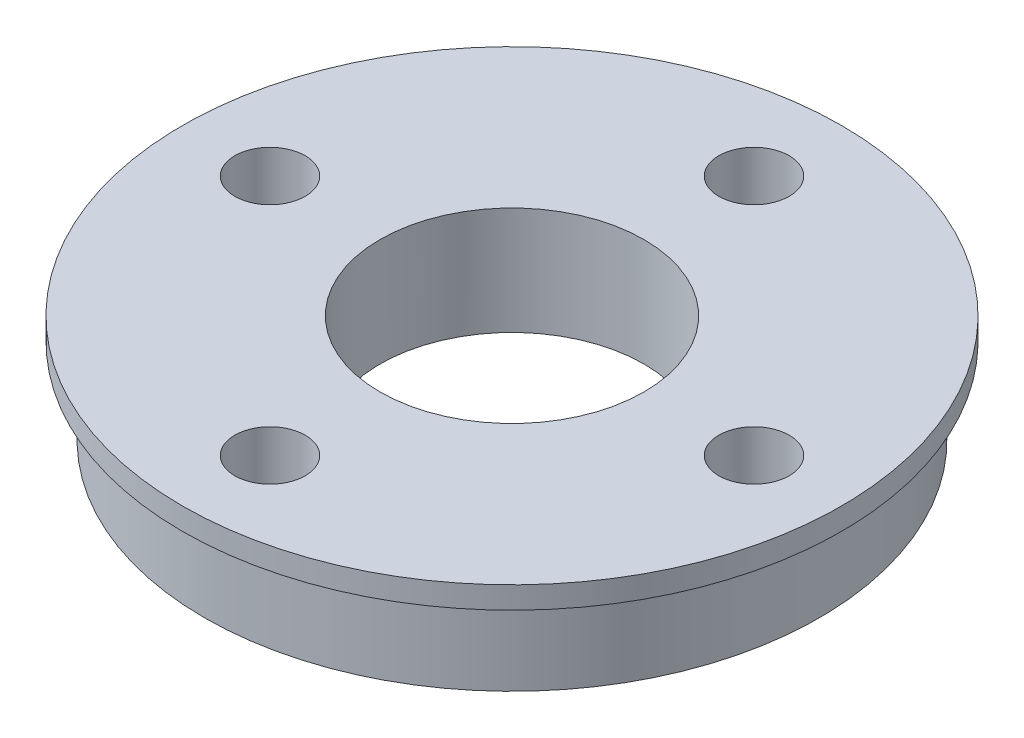
ISO-10303-21;
HEADER;
FILE_DESCRIPTION(('STEP AP214'),'2;1');
FILE_NAME('part.step','',(''),(''),'','','');
FILE_SCHEMA(('AUTOMOTIVE_DESIGN { 1 0 10303 214 1 1 1 1 }'));
ENDSEC;
DATA;
#1=APPLICATION_CONTEXT('core data for automotive mechanical design processes');
#2=APPLICATION_PROTOCOL_DEFINITION('international standard','automotive_design',2000,#1);
#3=PRODUCT_CONTEXT('',#1,'mechanical');
#4=PRODUCT('Part','Part','',(#3));
#5=PRODUCT_RELATED_PRODUCT_CATEGORY('part','',(#4));
#6=PRODUCT_DEFINITION_FORMATION('','',#4);
#7=PRODUCT_DEFINITION_CONTEXT('part definition',#1,'design');
#8=PRODUCT_DEFINITION('design','',#6,#7);
#9=PRODUCT_DEFINITION_SHAPE('','',#8);
#10=(LENGTH_UNIT() NAMED_UNIT(*) SI_UNIT(.MILLI.,.METRE.));
#11=(NAMED_UNIT(*) PLANE_ANGLE_UNIT() SI_UNIT($,.RADIAN.));
#12=(NAMED_UNIT(*) SI_UNIT($,.STERADIAN.) SOLID_ANGLE_UNIT());
#13=UNCERTAINTY_MEASURE_WITH_UNIT(LENGTH_MEASURE(1.E-05),#10,'distance_accuracy_value','');
#14=(GEOMETRIC_REPRESENTATION_CONTEXT(3) GLOBAL_UNCERTAINTY_ASSIGNED_CONTEXT((#13)) GLOBAL_UNIT_ASSIGNED_CONTEXT((#10,
#11,#12)) REPRESENTATION_CONTEXT('',''));
#15=CARTESIAN_POINT('',(0.,0.,0.));
#16=DIRECTION('',(0.,0.,1.));
#17=DIRECTION('',(1.,0.,0.));
#18=AXIS2_PLACEMENT_3D('',#15,#16,#17);
#19=CARTESIAN_POINT('',(0.,19.,0.));
#20=DIRECTION('',(0.,-1.,0.));
#21=DIRECTION('',(0.,0.,-1.));
#22=AXIS2_PLACEMENT_3D('',#19,#20,#21);
#23=CYLINDRICAL_SURFACE('',#22,6.);
#24=CARTESIAN_POINT('',(0.,5.,0.));
#25=DIRECTION('',(0.,1.,0.));
#26=DIRECTION('',(0.,0.,1.));
#27=AXIS2_PLACEMENT_3D('',#24,#25,#26);
#28=CIRCLE('',#27,6.);
#29=CARTESIAN_POINT('',(0.,5.,6.));
#30=VERTEX_POINT('',#29);
#31=EDGE_CURVE('E66',#30,#30,#28,.T.);
#32=ORIENTED_EDGE('',*,*,#31,.T.);
#33=EDGE_LOOP('',(#32));
#34=FACE_BOUND('',#33,.T.);
#35=CARTESIAN_POINT('',(0.,0.0999999999999994,0.));
#36=DIRECTION('',(0.,-1.,0.));
#37=DIRECTION('',(0.,0.,-1.));
#38=AXIS2_PLACEMENT_3D('',#35,#36,#37);
#39=CIRCLE('',#38,6.);
#40=CARTESIAN_POINT('',(0.,0.0999999999999994,-6.));
#41=VERTEX_POINT('',#40);
#42=EDGE_CURVE('E47',#41,#41,#39,.F.);
#43=ORIENTED_EDGE('',*,*,#42,.F.);
#44=EDGE_LOOP('',(#43));
#45=FACE_BOUND('',#44,.T.);
#46=ADVANCED_FACE('F44',(#34,#45),#23,.F.);
#47=CARTESIAN_POINT('',(0.,4.,0.));
#48=DIRECTION('',(0.,-1.,0.));
#49=DIRECTION('',(0.,0.,-1.));
#50=AXIS2_PLACEMENT_3D('',#47,#48,#49);
#51=CYLINDRICAL_SURFACE('',#50,13.98);
#52=CARTESIAN_POINT('',(0.,4.,0.));
#53=DIRECTION('',(0.,1.,0.));
#54=DIRECTION('',(0.,0.,1.));
#55=AXIS2_PLACEMENT_3D('',#52,#53,#54);
#56=CIRCLE('',#55,13.98);
#57=CARTESIAN_POINT('',(0.,4.,13.98));
#58=VERTEX_POINT('',#57);
#59=EDGE_CURVE('E10',#58,#58,#56,.T.);
#60=ORIENTED_EDGE('',*,*,#59,.F.);
#61=EDGE_LOOP('',(#60));
#62=FACE_BOUND('',#61,.T.);
#63=CARTESIAN_POINT('',(0.,0.1,0.));
#64=DIRECTION('',(0.,-1.,0.));
#65=DIRECTION('',(0.,0.,-1.));
#66=AXIS2_PLACEMENT_3D('',#63,#64,#65);
#67=CIRCLE('',#66,13.98);
#68=CARTESIAN_POINT('',(0.,0.1,-13.98));
#69=VERTEX_POINT('',#68);
#70=EDGE_CURVE('E80',#69,#69,#67,.T.);
#71=ORIENTED_EDGE('',*,*,#70,.F.);
#72=EDGE_LOOP('',(#71));
#73=FACE_BOUND('',#72,.T.);
#74=ADVANCED_FACE('F50',(#62,#73),#51,.T.);
#75=CARTESIAN_POINT('',(-11.,19.,0.));
#76=DIRECTION('',(0.,-1.,0.));
#77=DIRECTION('',(0.,0.,-1.));
#78=AXIS2_PLACEMENT_3D('',#75,#76,#77);
#79=CYLINDRICAL_SURFACE('',#78,1.6);
#80=CARTESIAN_POINT('',(-11.,5.,0.));
#81=DIRECTION('',(0.,1.,0.));
#82=DIRECTION('',(0.,0.,1.));
#83=AXIS2_PLACEMENT_3D('',#80,#81,#82);
#84=CIRCLE('',#83,1.6);
#85=CARTESIAN_POINT('',(-11.,5.,1.6));
#86=VERTEX_POINT('',#85);
#87=EDGE_CURVE('E65',#86,#86,#84,.T.);
#88=ORIENTED_EDGE('',*,*,#87,.T.);
#89=EDGE_LOOP('',(#88));
#90=FACE_BOUND('',#89,.T.);
#91=CARTESIAN_POINT('',(-11.,0.0999999999999994,0.));
#92=DIRECTION('',(0.,-1.,0.));
#93=DIRECTION('',(0.,0.,-1.));
#94=AXIS2_PLACEMENT_3D('',#91,#92,#93);
#95=CIRCLE('',#94,1.6);
#96=CARTESIAN_POINT('',(-11.,0.0999999999999994,-1.6));
#97=VERTEX_POINT('',#96);
#98=EDGE_CURVE('E92',#97,#97,#95,.F.);
#99=ORIENTED_EDGE('',*,*,#98,.F.);
#100=EDGE_LOOP('',(#99));
#101=FACE_BOUND('',#100,.T.);
#102=ADVANCED_FACE('F128',(#90,#101),#79,.F.);
#103=CARTESIAN_POINT('',(0.,19.,-11.));
#104=DIRECTION('',(0.,-1.,0.));
#105=DIRECTION('',(0.,0.,-1.));
#106=AXIS2_PLACEMENT_3D('',#103,#104,#105);
#107=CYLINDRICAL_SURFACE('',#106,1.6);
#108=CARTESIAN_POINT('',(0.,5.,-11.));
#109=DIRECTION('',(0.,1.,0.));
#110=DIRECTION('',(0.,0.,1.));
#111=AXIS2_PLACEMENT_3D('',#108,#109,#110);
#112=CIRCLE('',#111,1.6);
#113=CARTESIAN_POINT('',(0.,5.,-9.4));
#114=VERTEX_POINT('',#113);
#115=EDGE_CURVE('E63',#114,#114,#112,.T.);
#116=ORIENTED_EDGE('',*,*,#115,.T.);
#117=EDGE_LOOP('',(#116));
#118=FACE_BOUND('',#117,.T.);
#119=CARTESIAN_POINT('',(0.,0.0999999999999994,-11.));
#120=DIRECTION('',(0.,-1.,0.));
#121=DIRECTION('',(0.,0.,-1.));
#122=AXIS2_PLACEMENT_3D('',#119,#120,#121);
#123=CIRCLE('',#122,1.6);
#124=CARTESIAN_POINT('',(0.,0.0999999999999994,-12.6));
#125=VERTEX_POINT('',#124);
#126=EDGE_CURVE('E82',#125,#125,#123,.F.);
#127=ORIENTED_EDGE('',*,*,#126,.F.);
#128=EDGE_LOOP('',(#127));
#129=FACE_BOUND('',#128,.T.);
#130=ADVANCED_FACE('F137',(#118,#129),#107,.F.);
#131=CARTESIAN_POINT('',(11.,19.,0.));
#132=DIRECTION('',(0.,-1.,0.));
#133=DIRECTION('',(0.,0.,-1.));
#134=AXIS2_PLACEMENT_3D('',#131,#132,#133);
#135=CYLINDRICAL_SURFACE('',#134,1.6);
#136=CARTESIAN_POINT('',(11.,5.,0.));
#137=DIRECTION('',(0.,1.,0.));
#138=DIRECTION('',(0.,0.,1.));
#139=AXIS2_PLACEMENT_3D('',#136,#137,#138);
#140=CIRCLE('',#139,1.6);
#141=CARTESIAN_POINT('',(11.,5.,1.6));
#142=VERTEX_POINT('',#141);
#143=EDGE_CURVE('E68',#142,#142,#140,.T.);
#144=ORIENTED_EDGE('',*,*,#143,.T.);
#145=EDGE_LOOP('',(#144));
#146=FACE_BOUND('',#145,.T.);
#147=CARTESIAN_POINT('',(11.,0.0999999999999994,0.));
#148=DIRECTION('',(0.,-1.,0.));
#149=DIRECTION('',(0.,0.,-1.));
#150=AXIS2_PLACEMENT_3D('',#147,#148,#149);
#151=CIRCLE('',#150,1.6);
#152=CARTESIAN_POINT('',(11.,0.0999999999999994,-1.6));
#153=VERTEX_POINT('',#152);
#154=EDGE_CURVE('E77',#153,#153,#151,.F.);
#155=ORIENTED_EDGE('',*,*,#154,.F.);
#156=EDGE_LOOP('',(#155));
#157=FACE_BOUND('',#156,.T.);
#158=ADVANCED_FACE('F134',(#146,#157),#135,.F.);
#159=CARTESIAN_POINT('',(0.,19.,11.));
#160=DIRECTION('',(0.,-1.,0.));
#161=DIRECTION('',(0.,0.,-1.));
#162=AXIS2_PLACEMENT_3D('',#159,#160,#161);
#163=CYLINDRICAL_SURFACE('',#162,1.6);
#164=CARTESIAN_POINT('',(0.,5.,11.));
#165=DIRECTION('',(0.,1.,0.));
#166=DIRECTION('',(0.,0.,1.));
#167=AXIS2_PLACEMENT_3D('',#164,#165,#166);
#168=CIRCLE('',#167,1.6);
#169=CARTESIAN_POINT('',(0.,5.,12.6));
#170=VERTEX_POINT('',#169);
#171=EDGE_CURVE('E75',#170,#170,#168,.T.);
#172=ORIENTED_EDGE('',*,*,#171,.T.);
#173=EDGE_LOOP('',(#172));
#174=FACE_BOUND('',#173,.T.);
#175=CARTESIAN_POINT('',(0.,0.0999999999999994,11.));
#176=DIRECTION('',(0.,-1.,0.));
#177=DIRECTION('',(0.,0.,-1.));
#178=AXIS2_PLACEMENT_3D('',#175,#176,#177);
#179=CIRCLE('',#178,1.6);
#180=CARTESIAN_POINT('',(0.,0.0999999999999994,9.4));
#181=VERTEX_POINT('',#180);
#182=EDGE_CURVE('E71',#181,#181,#179,.F.);
#183=ORIENTED_EDGE('',*,*,#182,.F.);
#184=EDGE_LOOP('',(#183));
#185=FACE_BOUND('',#184,.T.);
#186=ADVANCED_FACE('F109',(#174,#185),#163,.F.);
#187=CARTESIAN_POINT('',(0.,5.,0.));
#188=DIRECTION('',(0.,-1.,0.));
#189=DIRECTION('',(0.,0.,-1.));
#190=AXIS2_PLACEMENT_3D('',#187,#188,#189);
#191=CYLINDRICAL_SURFACE('',#190,14.98);
#192=CARTESIAN_POINT('',(0.,5.,0.));
#193=DIRECTION('',(0.,1.,0.));
#194=DIRECTION('',(0.,0.,1.));
#195=AXIS2_PLACEMENT_3D('',#192,#193,#194);
#196=CIRCLE('',#195,14.98);
#197=CARTESIAN_POINT('',(0.,5.,14.98));
#198=VERTEX_POINT('',#197);
#199=EDGE_CURVE('E52',#198,#198,#196,.T.);
#200=ORIENTED_EDGE('',*,*,#199,.F.);
#201=EDGE_LOOP('',(#200));
#202=FACE_BOUND('',#201,.T.);
#203=CARTESIAN_POINT('',(0.,4.,0.));
#204=DIRECTION('',(0.,1.,0.));
#205=DIRECTION('',(0.,0.,1.));
#206=AXIS2_PLACEMENT_3D('',#203,#204,#205);
#207=CIRCLE('',#206,14.98);
#208=CARTESIAN_POINT('',(0.,4.,14.98));
#209=VERTEX_POINT('',#208);
#210=EDGE_CURVE('E59',#209,#209,#207,.T.);
#211=ORIENTED_EDGE('',*,*,#210,.T.);
#212=EDGE_LOOP('',(#211));
#213=FACE_BOUND('',#212,.T.);
#214=ADVANCED_FACE('F101',(#202,#213),#191,.T.);
#215=CARTESIAN_POINT('',(0.,5.,0.));
#216=DIRECTION('',(0.,1.,0.));
#217=DIRECTION('',(0.,0.,1.));
#218=AXIS2_PLACEMENT_3D('',#215,#216,#217);
#219=PLANE('',#218);
#220=ORIENTED_EDGE('',*,*,#171,.F.);
#221=EDGE_LOOP('',(#220));
#222=FACE_BOUND('',#221,.T.);
#223=ORIENTED_EDGE('',*,*,#143,.F.);
#224=EDGE_LOOP('',(#223));
#225=FACE_BOUND('',#224,.T.);
#226=ORIENTED_EDGE('',*,*,#115,.F.);
#227=EDGE_LOOP('',(#226));
#228=FACE_BOUND('',#227,.T.);
#229=ORIENTED_EDGE('',*,*,#87,.F.);
#230=EDGE_LOOP('',(#229));
#231=FACE_BOUND('',#230,.T.);
#232=ORIENTED_EDGE('',*,*,#31,.F.);
#233=EDGE_LOOP('',(#232));
#234=FACE_BOUND('',#233,.T.);
#235=ORIENTED_EDGE('',*,*,#199,.T.);
#236=EDGE_LOOP('',(#235));
#237=FACE_BOUND('',#236,.T.);
#238=ADVANCED_FACE('F100',(#222,#225,#228,#231,#234,#237),#219,.T.);
#239=CARTESIAN_POINT('',(0.,4.,0.));
#240=DIRECTION('',(0.,1.,0.));
#241=DIRECTION('',(0.,0.,1.));
#242=AXIS2_PLACEMENT_3D('',#239,#240,#241);
#243=PLANE('',#242);
#244=ORIENTED_EDGE('',*,*,#59,.T.);
#245=EDGE_LOOP('',(#244));
#246=FACE_BOUND('',#245,.T.);
#247=ORIENTED_EDGE('',*,*,#210,.F.);
#248=EDGE_LOOP('',(#247));
#249=FACE_BOUND('',#248,.T.);
#250=ADVANCED_FACE('F105',(#246,#249),#243,.F.);
#251=CARTESIAN_POINT('',(0.,0.1,0.));
#252=DIRECTION('',(0.,-1.,0.));
#253=DIRECTION('',(0.,0.,-1.));
#254=AXIS2_PLACEMENT_3D('',#251,#252,#253);
#255=PLANE('',#254);
#256=ORIENTED_EDGE('',*,*,#98,.T.);
#257=EDGE_LOOP('',(#256));
#258=FACE_BOUND('',#257,.T.);
#259=ORIENTED_EDGE('',*,*,#154,.T.);
#260=EDGE_LOOP('',(#259));
#261=FACE_BOUND('',#260,.T.);
#262=ORIENTED_EDGE('',*,*,#70,.T.);
#263=EDGE_LOOP('',(#262));
#264=FACE_BOUND('',#263,.T.);
#265=ORIENTED_EDGE('',*,*,#182,.T.);
#266=EDGE_LOOP('',(#265));
#267=FACE_BOUND('',#266,.T.);
#268=ORIENTED_EDGE('',*,*,#126,.T.);
#269=EDGE_LOOP('',(#268));
#270=FACE_BOUND('',#269,.T.);
#271=ORIENTED_EDGE('',*,*,#42,.T.);
#272=EDGE_LOOP('',(#271));
#273=FACE_BOUND('',#272,.T.);
#274=ADVANCED_FACE('F114',(#258,#261,#264,#267,#270,#273),#255,.T.);
#275=CLOSED_SHELL('',(#46,#74,#102,#130,#158,#186,#214,#238,#250,#274));
#276=MANIFOLD_SOLID_BREP('B2',#275);
#277=ADVANCED_BREP_SHAPE_REPRESENTATION('',(#18,#276),#14);
#278=SHAPE_DEFINITION_REPRESENTATION(#9,#277);
ENDSEC;
END-ISO-10303-21;
